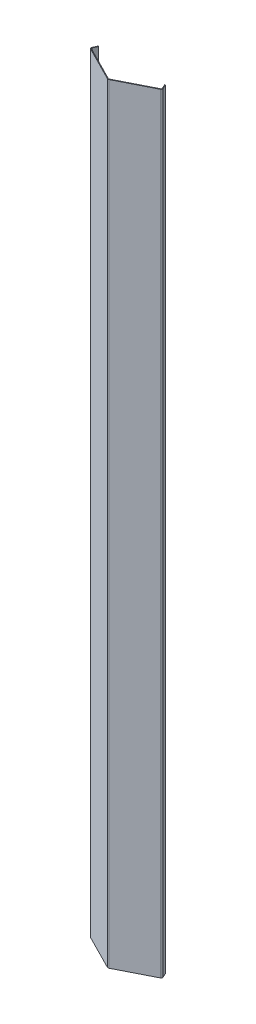
ISO-10303-21;
HEADER;
FILE_DESCRIPTION(('STEP AP214'),'2;1');
FILE_NAME('part.step','',(''),(''),'','','');
FILE_SCHEMA(('AUTOMOTIVE_DESIGN { 1 0 10303 214 1 1 1 1 }'));
ENDSEC;
DATA;
#1=APPLICATION_CONTEXT('core data for automotive mechanical design processes');
#2=APPLICATION_PROTOCOL_DEFINITION('international standard','automotive_design',2000,#1);
#3=PRODUCT_CONTEXT('',#1,'mechanical');
#4=PRODUCT('Part','Part','',(#3));
#5=PRODUCT_RELATED_PRODUCT_CATEGORY('part','',(#4));
#6=PRODUCT_DEFINITION_FORMATION('','',#4);
#7=PRODUCT_DEFINITION_CONTEXT('part definition',#1,'design');
#8=PRODUCT_DEFINITION('design','',#6,#7);
#9=PRODUCT_DEFINITION_SHAPE('','',#8);
#10=(LENGTH_UNIT() NAMED_UNIT(*) SI_UNIT(.MILLI.,.METRE.));
#11=(NAMED_UNIT(*) PLANE_ANGLE_UNIT() SI_UNIT($,.RADIAN.));
#12=(NAMED_UNIT(*) SI_UNIT($,.STERADIAN.) SOLID_ANGLE_UNIT());
#13=UNCERTAINTY_MEASURE_WITH_UNIT(LENGTH_MEASURE(1.E-05),#10,'distance_accuracy_value','');
#14=(GEOMETRIC_REPRESENTATION_CONTEXT(3) GLOBAL_UNCERTAINTY_ASSIGNED_CONTEXT((#13)) GLOBAL_UNIT_ASSIGNED_CONTEXT((#10,
#11,#12)) REPRESENTATION_CONTEXT('',''));
#15=CARTESIAN_POINT('',(0.,0.,0.));
#16=DIRECTION('',(0.,0.,1.));
#17=DIRECTION('',(1.,0.,0.));
#18=AXIS2_PLACEMENT_3D('',#15,#16,#17);
#19=CARTESIAN_POINT('',(-102.841397195583,4830.,-134.965277777778));
#20=DIRECTION('',(-0.409836101706064,0.,0.912159180043909));
#21=DIRECTION('',(0.912159180043909,0.,0.409836101706064));
#22=AXIS2_PLACEMENT_3D('',#19,#20,#21);
#23=PLANE('',#22);
#24=DIRECTION('',(-0.912159180043909,0.,-0.409836101706064));
#25=VECTOR('',#24,1.);
#26=CARTESIAN_POINT('',(-102.841397195583,0.,-134.965277777778));
#27=LINE('',#26,#25);
#28=CARTESIAN_POINT('',(-99.1927604754076,0.,-133.325933370954));
#29=VERTEX_POINT('',#28);
#30=CARTESIAN_POINT('',(-102.841397195583,0.,-134.965277777778));
#31=VERTEX_POINT('',#30);
#32=EDGE_CURVE('E177',#29,#31,#27,.T.);
#33=ORIENTED_EDGE('',*,*,#32,.T.);
#34=DIRECTION('',(0.,-1.,0.));
#35=VECTOR('',#34,1.);
#36=CARTESIAN_POINT('',(-102.841397195583,4830.,-134.965277777778));
#37=LINE('',#36,#35);
#38=CARTESIAN_POINT('',(-102.841397195583,4830.,-134.965277777778));
#39=VERTEX_POINT('',#38);
#40=EDGE_CURVE('E11',#39,#31,#37,.T.);
#41=ORIENTED_EDGE('',*,*,#40,.F.);
#42=DIRECTION('',(-0.912159180043909,0.,-0.409836101706064));
#43=VECTOR('',#42,1.);
#44=CARTESIAN_POINT('',(-102.841397195583,4830.,-134.965277777778));
#45=LINE('',#44,#43);
#46=CARTESIAN_POINT('',(-99.1927604754076,4830.,-133.325933370954));
#47=VERTEX_POINT('',#46);
#48=EDGE_CURVE('E207',#47,#39,#45,.T.);
#49=ORIENTED_EDGE('',*,*,#48,.F.);
#50=DIRECTION('',(0.,-1.,0.));
#51=VECTOR('',#50,1.);
#52=CARTESIAN_POINT('',(-99.1927604754076,4830.,-133.325933370954));
#53=LINE('',#52,#51);
#54=EDGE_CURVE('E173',#47,#29,#53,.T.);
#55=ORIENTED_EDGE('',*,*,#54,.T.);
#56=EDGE_LOOP('',(#33,#41,#49,#55));
#57=FACE_BOUND('',#56,.T.);
#58=ADVANCED_FACE('F33',(#57),#23,.F.);
#59=CARTESIAN_POINT('',(-102.841397195583,4830.,-134.965277777778));
#60=DIRECTION('',(0.91215918004391,0.,0.409836101706063));
#61=DIRECTION('',(0.409836101706063,0.,-0.91215918004391));
#62=AXIS2_PLACEMENT_3D('',#59,#60,#61);
#63=PLANE('',#62);
#64=DIRECTION('',(-0.409836101706063,0.,0.91215918004391));
#65=VECTOR('',#64,1.);
#66=CARTESIAN_POINT('',(-102.841397195583,0.,-134.965277777778));
#67=LINE('',#66,#65);
#68=CARTESIAN_POINT('',(-115.114033485366,0.,-107.65046141957));
#69=VERTEX_POINT('',#68);
#70=EDGE_CURVE('E180',#31,#69,#67,.T.);
#71=ORIENTED_EDGE('',*,*,#70,.T.);
#72=DIRECTION('',(0.,-1.,0.));
#73=VECTOR('',#72,1.);
#74=CARTESIAN_POINT('',(-115.114033485366,4830.,-107.65046141957));
#75=LINE('',#74,#73);
#76=CARTESIAN_POINT('',(-115.114033485366,4830.,-107.65046141957));
#77=VERTEX_POINT('',#76);
#78=EDGE_CURVE('E41',#77,#69,#75,.T.);
#79=ORIENTED_EDGE('',*,*,#78,.F.);
#80=DIRECTION('',(-0.409836101706063,0.,0.91215918004391));
#81=VECTOR('',#80,1.);
#82=CARTESIAN_POINT('',(-102.841397195583,4830.,-134.965277777778));
#83=LINE('',#82,#81);
#84=EDGE_CURVE('E116',#39,#77,#83,.T.);
#85=ORIENTED_EDGE('',*,*,#84,.F.);
#86=ORIENTED_EDGE('',*,*,#40,.T.);
#87=EDGE_LOOP('',(#71,#79,#85,#86));
#88=FACE_BOUND('',#87,.T.);
#89=ADVANCED_FACE('F305',(#88),#63,.F.);
#90=CARTESIAN_POINT('',(-105.992441684927,4830.,-103.552100402509));
#91=DIRECTION('',(0.,-1.,0.));
#92=DIRECTION('',(0.,0.,-1.));
#93=AXIS2_PLACEMENT_3D('',#90,#91,#92);
#94=CYLINDRICAL_SURFACE('',#93,10.);
#95=CARTESIAN_POINT('',(-105.992441684927,0.,-103.552100402509));
#96=DIRECTION('',(0.,1.,0.));
#97=DIRECTION('',(0.,0.,1.));
#98=AXIS2_PLACEMENT_3D('',#95,#96,#97);
#99=CIRCLE('',#98,10.);
#100=CARTESIAN_POINT('',(-110.511946464936,0.,-94.6316701133653));
#101=VERTEX_POINT('',#100);
#102=EDGE_CURVE('E182',#69,#101,#99,.T.);
#103=ORIENTED_EDGE('',*,*,#102,.T.);
#104=DIRECTION('',(0.,-1.,0.));
#105=VECTOR('',#104,1.);
#106=CARTESIAN_POINT('',(-110.511946464936,4830.,-94.6316701133653));
#107=LINE('',#106,#105);
#108=CARTESIAN_POINT('',(-110.511946464936,4830.,-94.6316701133653));
#109=VERTEX_POINT('',#108);
#110=EDGE_CURVE('E238',#109,#101,#107,.T.);
#111=ORIENTED_EDGE('',*,*,#110,.F.);
#112=CARTESIAN_POINT('',(-105.992441684927,4830.,-103.552100402509));
#113=DIRECTION('',(0.,1.,0.));
#114=DIRECTION('',(0.,0.,1.));
#115=AXIS2_PLACEMENT_3D('',#112,#113,#114);
#116=CIRCLE('',#115,10.);
#117=EDGE_CURVE('E246',#77,#109,#116,.T.);
#118=ORIENTED_EDGE('',*,*,#117,.F.);
#119=ORIENTED_EDGE('',*,*,#78,.T.);
#120=EDGE_LOOP('',(#103,#111,#118,#119));
#121=FACE_BOUND('',#120,.T.);
#122=ADVANCED_FACE('F244',(#121),#94,.T.);
#123=CARTESIAN_POINT('',(103.67090773331,4830.,13.8833232186408));
#124=DIRECTION('',(0.451950478000949,0.,-0.892043028914365));
#125=DIRECTION('',(-0.892043028914365,0.,-0.451950478000949));
#126=AXIS2_PLACEMENT_3D('',#123,#124,#125);
#127=PLANE('',#126);
#128=DIRECTION('',(0.892043028914365,0.,0.451950478000949));
#129=VECTOR('',#128,1.);
#130=CARTESIAN_POINT('',(103.67090773331,0.,13.8833232186408));
#131=LINE('',#130,#129);
#132=CARTESIAN_POINT('',(103.67090773331,0.,13.8833232186408));
#133=VERTEX_POINT('',#132);
#134=EDGE_CURVE('E184',#101,#133,#131,.T.);
#135=ORIENTED_EDGE('',*,*,#134,.T.);
#136=DIRECTION('',(0.,-1.,0.));
#137=VECTOR('',#136,1.);
#138=CARTESIAN_POINT('',(103.67090773331,4830.,13.8833232186408));
#139=LINE('',#138,#137);
#140=CARTESIAN_POINT('',(103.67090773331,4830.,13.8833232186408));
#141=VERTEX_POINT('',#140);
#142=EDGE_CURVE('E235',#141,#133,#139,.T.);
#143=ORIENTED_EDGE('',*,*,#142,.F.);
#144=DIRECTION('',(0.892043028914365,0.,0.451950478000949));
#145=VECTOR('',#144,1.);
#146=CARTESIAN_POINT('',(103.67090773331,4830.,13.8833232186408));
#147=LINE('',#146,#145);
#148=EDGE_CURVE('E264',#109,#141,#147,.T.);
#149=ORIENTED_EDGE('',*,*,#148,.F.);
#150=ORIENTED_EDGE('',*,*,#110,.T.);
#151=EDGE_LOOP('',(#135,#143,#149,#150));
#152=FACE_BOUND('',#151,.T.);
#153=ADVANCED_FACE('F255',(#152),#127,.F.);
#154=CARTESIAN_POINT('',(108.19041251332,4830.,4.96289292949717));
#155=DIRECTION('',(0.,-1.,0.));
#156=DIRECTION('',(0.,0.,-1.));
#157=AXIS2_PLACEMENT_3D('',#154,#155,#156);
#158=CYLINDRICAL_SURFACE('',#157,10.);
#159=CARTESIAN_POINT('',(108.19041251332,0.,4.96289292949717));
#160=DIRECTION('',(0.,1.,0.));
#161=DIRECTION('',(0.,0.,1.));
#162=AXIS2_PLACEMENT_3D('',#159,#160,#161);
#163=CIRCLE('',#162,10.);
#164=CARTESIAN_POINT('',(112.709917293329,0.,13.8833232186408));
#165=VERTEX_POINT('',#164);
#166=EDGE_CURVE('E186',#133,#165,#163,.T.);
#167=ORIENTED_EDGE('',*,*,#166,.T.);
#168=DIRECTION('',(0.,-1.,0.));
#169=VECTOR('',#168,1.);
#170=CARTESIAN_POINT('',(112.709917293329,4830.,13.8833232186408));
#171=LINE('',#170,#169);
#172=CARTESIAN_POINT('',(112.709917293329,4830.,13.8833232186408));
#173=VERTEX_POINT('',#172);
#174=EDGE_CURVE('E232',#173,#165,#171,.T.);
#175=ORIENTED_EDGE('',*,*,#174,.F.);
#176=CARTESIAN_POINT('',(108.19041251332,4830.,4.96289292949717));
#177=DIRECTION('',(0.,1.,0.));
#178=DIRECTION('',(0.,0.,1.));
#179=AXIS2_PLACEMENT_3D('',#176,#177,#178);
#180=CIRCLE('',#179,10.);
#181=EDGE_CURVE('E261',#141,#173,#180,.T.);
#182=ORIENTED_EDGE('',*,*,#181,.F.);
#183=ORIENTED_EDGE('',*,*,#142,.T.);
#184=EDGE_LOOP('',(#167,#175,#182,#183));
#185=FACE_BOUND('',#184,.T.);
#186=ADVANCED_FACE('F259',(#185),#158,.T.);
#187=CARTESIAN_POINT('',(112.709917293329,4830.,13.8833232186408));
#188=DIRECTION('',(-0.451950478000949,0.,-0.892043028914365));
#189=DIRECTION('',(-0.892043028914365,0.,0.451950478000949));
#190=AXIS2_PLACEMENT_3D('',#187,#188,#189);
#191=PLANE('',#190);
#192=DIRECTION('',(0.892043028914365,0.,-0.451950478000949));
#193=VECTOR('',#192,1.);
#194=CARTESIAN_POINT('',(112.709917293329,0.,13.8833232186408));
#195=LINE('',#194,#193);
#196=CARTESIAN_POINT('',(326.892771491575,0.,-94.6316701133653));
#197=VERTEX_POINT('',#196);
#198=EDGE_CURVE('E188',#165,#197,#195,.T.);
#199=ORIENTED_EDGE('',*,*,#198,.T.);
#200=DIRECTION('',(0.,-1.,0.));
#201=VECTOR('',#200,1.);
#202=CARTESIAN_POINT('',(326.892771491575,4830.,-94.6316701133653));
#203=LINE('',#202,#201);
#204=CARTESIAN_POINT('',(326.892771491575,4830.,-94.6316701133653));
#205=VERTEX_POINT('',#204);
#206=EDGE_CURVE('E229',#205,#197,#203,.T.);
#207=ORIENTED_EDGE('',*,*,#206,.F.);
#208=DIRECTION('',(0.892043028914365,0.,-0.451950478000949));
#209=VECTOR('',#208,1.);
#210=CARTESIAN_POINT('',(112.709917293329,4830.,13.8833232186408));
#211=LINE('',#210,#209);
#212=EDGE_CURVE('E263',#173,#205,#211,.T.);
#213=ORIENTED_EDGE('',*,*,#212,.F.);
#214=ORIENTED_EDGE('',*,*,#174,.T.);
#215=EDGE_LOOP('',(#199,#207,#213,#214));
#216=FACE_BOUND('',#215,.T.);
#217=ADVANCED_FACE('F318',(#216),#191,.F.);
#218=CARTESIAN_POINT('',(322.373266711566,4830.,-103.552100402509));
#219=DIRECTION('',(0.,-1.,0.));
#220=DIRECTION('',(0.,0.,-1.));
#221=AXIS2_PLACEMENT_3D('',#218,#219,#220);
#222=CYLINDRICAL_SURFACE('',#221,10.);
#223=CARTESIAN_POINT('',(322.373266711566,0.,-103.552100402509));
#224=DIRECTION('',(0.,1.,0.));
#225=DIRECTION('',(0.,0.,-1.));
#226=AXIS2_PLACEMENT_3D('',#223,#224,#225);
#227=CIRCLE('',#226,10.);
#228=CARTESIAN_POINT('',(331.494858512005,0.,-107.65046141957));
#229=VERTEX_POINT('',#228);
#230=EDGE_CURVE('E190',#197,#229,#227,.T.);
#231=ORIENTED_EDGE('',*,*,#230,.T.);
#232=DIRECTION('',(0.,-1.,0.));
#233=VECTOR('',#232,1.);
#234=CARTESIAN_POINT('',(331.494858512005,4830.,-107.65046141957));
#235=LINE('',#234,#233);
#236=CARTESIAN_POINT('',(331.494858512005,4830.,-107.65046141957));
#237=VERTEX_POINT('',#236);
#238=EDGE_CURVE('E226',#237,#229,#235,.T.);
#239=ORIENTED_EDGE('',*,*,#238,.F.);
#240=CARTESIAN_POINT('',(322.373266711566,4830.,-103.552100402509));
#241=DIRECTION('',(0.,1.,0.));
#242=DIRECTION('',(0.,0.,-1.));
#243=AXIS2_PLACEMENT_3D('',#240,#241,#242);
#244=CIRCLE('',#243,10.);
#245=EDGE_CURVE('E266',#205,#237,#244,.T.);
#246=ORIENTED_EDGE('',*,*,#245,.F.);
#247=ORIENTED_EDGE('',*,*,#206,.T.);
#248=EDGE_LOOP('',(#231,#239,#246,#247));
#249=FACE_BOUND('',#248,.T.);
#250=ADVANCED_FACE('F321',(#249),#222,.T.);
#251=CARTESIAN_POINT('',(319.222222222222,4830.,-134.965277777778));
#252=DIRECTION('',(-0.91215918004391,0.,0.409836101706063));
#253=DIRECTION('',(0.409836101706063,0.,0.91215918004391));
#254=AXIS2_PLACEMENT_3D('',#251,#252,#253);
#255=PLANE('',#254);
#256=DIRECTION('',(-0.409836101706063,0.,-0.91215918004391));
#257=VECTOR('',#256,1.);
#258=CARTESIAN_POINT('',(319.222222222222,0.,-134.965277777778));
#259=LINE('',#258,#257);
#260=CARTESIAN_POINT('',(319.222222222222,0.,-134.965277777778));
#261=VERTEX_POINT('',#260);
#262=EDGE_CURVE('E192',#229,#261,#259,.T.);
#263=ORIENTED_EDGE('',*,*,#262,.T.);
#264=DIRECTION('',(0.,-1.,0.));
#265=VECTOR('',#264,1.);
#266=CARTESIAN_POINT('',(319.222222222222,4830.,-134.965277777778));
#267=LINE('',#266,#265);
#268=CARTESIAN_POINT('',(319.222222222222,4830.,-134.965277777778));
#269=VERTEX_POINT('',#268);
#270=EDGE_CURVE('E223',#269,#261,#267,.T.);
#271=ORIENTED_EDGE('',*,*,#270,.F.);
#272=DIRECTION('',(-0.409836101706063,0.,-0.91215918004391));
#273=VECTOR('',#272,1.);
#274=CARTESIAN_POINT('',(319.222222222222,4830.,-134.965277777778));
#275=LINE('',#274,#273);
#276=EDGE_CURVE('E272',#237,#269,#275,.T.);
#277=ORIENTED_EDGE('',*,*,#276,.F.);
#278=ORIENTED_EDGE('',*,*,#238,.T.);
#279=EDGE_LOOP('',(#263,#271,#277,#278));
#280=FACE_BOUND('',#279,.T.);
#281=ADVANCED_FACE('F325',(#280),#255,.F.);
#282=CARTESIAN_POINT('',(319.222222222222,4830.,-134.965277777778));
#283=DIRECTION('',(0.409836101706065,0.,0.912159180043909));
#284=DIRECTION('',(0.912159180043909,0.,-0.409836101706065));
#285=AXIS2_PLACEMENT_3D('',#282,#283,#284);
#286=PLANE('',#285);
#287=DIRECTION('',(-0.912159180043909,0.,0.409836101706065));
#288=VECTOR('',#287,1.);
#289=CARTESIAN_POINT('',(319.222222222222,0.,-134.965277777778));
#290=LINE('',#289,#288);
#291=CARTESIAN_POINT('',(315.573585502047,0.,-133.325933370954));
#292=VERTEX_POINT('',#291);
#293=EDGE_CURVE('E194',#261,#292,#290,.T.);
#294=ORIENTED_EDGE('',*,*,#293,.T.);
#295=DIRECTION('',(0.,-1.,0.));
#296=VECTOR('',#295,1.);
#297=CARTESIAN_POINT('',(315.573585502047,4830.,-133.325933370954));
#298=LINE('',#297,#296);
#299=CARTESIAN_POINT('',(315.573585502047,4830.,-133.325933370954));
#300=VERTEX_POINT('',#299);
#301=EDGE_CURVE('E220',#300,#292,#298,.T.);
#302=ORIENTED_EDGE('',*,*,#301,.F.);
#303=DIRECTION('',(-0.912159180043909,0.,0.409836101706065));
#304=VECTOR('',#303,1.);
#305=CARTESIAN_POINT('',(319.222222222222,4830.,-134.965277777778));
#306=LINE('',#305,#304);
#307=EDGE_CURVE('E274',#269,#300,#306,.T.);
#308=ORIENTED_EDGE('',*,*,#307,.F.);
#309=ORIENTED_EDGE('',*,*,#270,.T.);
#310=EDGE_LOOP('',(#294,#302,#308,#309));
#311=FACE_BOUND('',#310,.T.);
#312=ADVANCED_FACE('F329',(#311),#286,.F.);
#313=CARTESIAN_POINT('',(315.573585502047,4830.,-133.325933370954));
#314=DIRECTION('',(0.912159180043909,0.,-0.409836101706063));
#315=DIRECTION('',(-0.409836101706063,0.,-0.91215918004391));
#316=AXIS2_PLACEMENT_3D('',#313,#314,#315);
#317=PLANE('',#316);
#318=DIRECTION('',(0.409836101706063,0.,0.91215918004391));
#319=VECTOR('',#318,1.);
#320=CARTESIAN_POINT('',(315.573585502047,0.,-133.325933370954));
#321=LINE('',#320,#319);
#322=CARTESIAN_POINT('',(327.846221791829,0.,-106.011117012745));
#323=VERTEX_POINT('',#322);
#324=EDGE_CURVE('E196',#292,#323,#321,.T.);
#325=ORIENTED_EDGE('',*,*,#324,.T.);
#326=DIRECTION('',(0.,-1.,0.));
#327=VECTOR('',#326,1.);
#328=CARTESIAN_POINT('',(327.846221791829,4830.,-106.011117012745));
#329=LINE('',#328,#327);
#330=CARTESIAN_POINT('',(327.846221791829,4830.,-106.011117012745));
#331=VERTEX_POINT('',#330);
#332=EDGE_CURVE('E217',#331,#323,#329,.T.);
#333=ORIENTED_EDGE('',*,*,#332,.F.);
#334=DIRECTION('',(0.409836101706063,0.,0.91215918004391));
#335=VECTOR('',#334,1.);
#336=CARTESIAN_POINT('',(315.573585502047,4830.,-133.325933370954));
#337=LINE('',#336,#335);
#338=EDGE_CURVE('E276',#300,#331,#337,.T.);
#339=ORIENTED_EDGE('',*,*,#338,.F.);
#340=ORIENTED_EDGE('',*,*,#301,.T.);
#341=EDGE_LOOP('',(#325,#333,#339,#340));
#342=FACE_BOUND('',#341,.T.);
#343=ADVANCED_FACE('F333',(#342),#317,.F.);
#344=CARTESIAN_POINT('',(322.373266711566,4830.,-103.552100402509));
#345=DIRECTION('',(0.,-1.,0.));
#346=DIRECTION('',(0.,0.,-1.));
#347=AXIS2_PLACEMENT_3D('',#344,#345,#346);
#348=CYLINDRICAL_SURFACE('',#347,6.);
#349=CARTESIAN_POINT('',(322.373266711566,0.,-103.552100402509));
#350=DIRECTION('',(0.,-1.,0.));
#351=DIRECTION('',(0.,0.,-1.));
#352=AXIS2_PLACEMENT_3D('',#349,#350,#351);
#353=CIRCLE('',#352,6.);
#354=CARTESIAN_POINT('',(325.084969579571,0.,-98.1998422290227));
#355=VERTEX_POINT('',#354);
#356=EDGE_CURVE('E198',#323,#355,#353,.T.);
#357=ORIENTED_EDGE('',*,*,#356,.T.);
#358=DIRECTION('',(0.,-1.,0.));
#359=VECTOR('',#358,1.);
#360=CARTESIAN_POINT('',(325.084969579571,4830.,-98.1998422290227));
#361=LINE('',#360,#359);
#362=CARTESIAN_POINT('',(325.084969579571,4830.,-98.1998422290227));
#363=VERTEX_POINT('',#362);
#364=EDGE_CURVE('E214',#363,#355,#361,.T.);
#365=ORIENTED_EDGE('',*,*,#364,.F.);
#366=CARTESIAN_POINT('',(322.373266711566,4830.,-103.552100402509));
#367=DIRECTION('',(0.,-1.,0.));
#368=DIRECTION('',(0.,0.,-1.));
#369=AXIS2_PLACEMENT_3D('',#366,#367,#368);
#370=CIRCLE('',#369,6.);
#371=EDGE_CURVE('E278',#331,#363,#370,.T.);
#372=ORIENTED_EDGE('',*,*,#371,.F.);
#373=ORIENTED_EDGE('',*,*,#332,.T.);
#374=EDGE_LOOP('',(#357,#365,#372,#373));
#375=FACE_BOUND('',#374,.T.);
#376=ADVANCED_FACE('F337',(#375),#348,.F.);
#377=CARTESIAN_POINT('',(110.902115381325,4830.,10.3151511029834));
#378=DIRECTION('',(0.451950478000949,0.,0.892043028914364));
#379=DIRECTION('',(0.892043028914365,0.,-0.451950478000949));
#380=AXIS2_PLACEMENT_3D('',#377,#378,#379);
#381=PLANE('',#380);
#382=DIRECTION('',(-0.892043028914365,0.,0.451950478000949));
#383=VECTOR('',#382,1.);
#384=CARTESIAN_POINT('',(110.902115381325,0.,10.3151511029834));
#385=LINE('',#384,#383);
#386=CARTESIAN_POINT('',(110.902115381325,0.,10.3151511029834));
#387=VERTEX_POINT('',#386);
#388=EDGE_CURVE('E200',#355,#387,#385,.T.);
#389=ORIENTED_EDGE('',*,*,#388,.T.);
#390=DIRECTION('',(0.,-1.,0.));
#391=VECTOR('',#390,1.);
#392=CARTESIAN_POINT('',(110.902115381325,4830.,10.3151511029834));
#393=LINE('',#392,#391);
#394=CARTESIAN_POINT('',(110.902115381325,4830.,10.3151511029834));
#395=VERTEX_POINT('',#394);
#396=EDGE_CURVE('E211',#395,#387,#393,.T.);
#397=ORIENTED_EDGE('',*,*,#396,.F.);
#398=DIRECTION('',(-0.892043028914365,0.,0.451950478000949));
#399=VECTOR('',#398,1.);
#400=CARTESIAN_POINT('',(110.902115381325,4830.,10.3151511029834));
#401=LINE('',#400,#399);
#402=EDGE_CURVE('E280',#363,#395,#401,.T.);
#403=ORIENTED_EDGE('',*,*,#402,.F.);
#404=ORIENTED_EDGE('',*,*,#364,.T.);
#405=EDGE_LOOP('',(#389,#397,#403,#404));
#406=FACE_BOUND('',#405,.T.);
#407=ADVANCED_FACE('F286',(#406),#381,.F.);
#408=CARTESIAN_POINT('',(108.19041251332,4830.,4.96289292949717));
#409=DIRECTION('',(0.,-1.,0.));
#410=DIRECTION('',(0.,0.,-1.));
#411=AXIS2_PLACEMENT_3D('',#408,#409,#410);
#412=CYLINDRICAL_SURFACE('',#411,6.00000000000002);
#413=CARTESIAN_POINT('',(108.19041251332,0.,4.96289292949717));
#414=DIRECTION('',(0.,-1.,0.));
#415=DIRECTION('',(0.,0.,1.));
#416=AXIS2_PLACEMENT_3D('',#413,#414,#415);
#417=CIRCLE('',#416,6.00000000000002);
#418=CARTESIAN_POINT('',(105.478709645314,0.,10.3151511029834));
#419=VERTEX_POINT('',#418);
#420=EDGE_CURVE('E202',#387,#419,#417,.T.);
#421=ORIENTED_EDGE('',*,*,#420,.T.);
#422=DIRECTION('',(0.,-1.,0.));
#423=VECTOR('',#422,1.);
#424=CARTESIAN_POINT('',(105.478709645314,4830.,10.3151511029834));
#425=LINE('',#424,#423);
#426=CARTESIAN_POINT('',(105.478709645314,4830.,10.3151511029834));
#427=VERTEX_POINT('',#426);
#428=EDGE_CURVE('E168',#427,#419,#425,.T.);
#429=ORIENTED_EDGE('',*,*,#428,.F.);
#430=CARTESIAN_POINT('',(108.19041251332,4830.,4.96289292949717));
#431=DIRECTION('',(0.,-1.,0.));
#432=DIRECTION('',(0.,0.,1.));
#433=AXIS2_PLACEMENT_3D('',#430,#431,#432);
#434=CIRCLE('',#433,6.00000000000002);
#435=EDGE_CURVE('E159',#395,#427,#434,.T.);
#436=ORIENTED_EDGE('',*,*,#435,.F.);
#437=ORIENTED_EDGE('',*,*,#396,.T.);
#438=EDGE_LOOP('',(#421,#429,#436,#437));
#439=FACE_BOUND('',#438,.T.);
#440=ADVANCED_FACE('F290',(#439),#412,.F.);
#441=CARTESIAN_POINT('',(105.478709645314,4830.,10.3151511029834));
#442=DIRECTION('',(-0.451950478000949,0.,0.892043028914364));
#443=DIRECTION('',(0.892043028914365,0.,0.451950478000949));
#444=AXIS2_PLACEMENT_3D('',#441,#442,#443);
#445=PLANE('',#444);
#446=DIRECTION('',(-0.892043028914365,0.,-0.451950478000949));
#447=VECTOR('',#446,1.);
#448=CARTESIAN_POINT('',(105.478709645314,0.,10.3151511029834));
#449=LINE('',#448,#447);
#450=CARTESIAN_POINT('',(-108.704144552932,0.,-98.1998422290227));
#451=VERTEX_POINT('',#450);
#452=EDGE_CURVE('E167',#419,#451,#449,.T.);
#453=ORIENTED_EDGE('',*,*,#452,.T.);
#454=DIRECTION('',(0.,-1.,0.));
#455=VECTOR('',#454,1.);
#456=CARTESIAN_POINT('',(-108.704144552932,4830.,-98.1998422290227));
#457=LINE('',#456,#455);
#458=CARTESIAN_POINT('',(-108.704144552932,4830.,-98.1998422290227));
#459=VERTEX_POINT('',#458);
#460=EDGE_CURVE('E164',#459,#451,#457,.T.);
#461=ORIENTED_EDGE('',*,*,#460,.F.);
#462=DIRECTION('',(-0.892043028914365,0.,-0.451950478000949));
#463=VECTOR('',#462,1.);
#464=CARTESIAN_POINT('',(105.478709645314,4830.,10.3151511029834));
#465=LINE('',#464,#463);
#466=EDGE_CURVE('E153',#427,#459,#465,.T.);
#467=ORIENTED_EDGE('',*,*,#466,.F.);
#468=ORIENTED_EDGE('',*,*,#428,.T.);
#469=EDGE_LOOP('',(#453,#461,#467,#468));
#470=FACE_BOUND('',#469,.T.);
#471=ADVANCED_FACE('F165',(#470),#445,.F.);
#472=CARTESIAN_POINT('',(-105.992441684927,4830.,-103.552100402509));
#473=DIRECTION('',(0.,-1.,0.));
#474=DIRECTION('',(0.,0.,-1.));
#475=AXIS2_PLACEMENT_3D('',#472,#473,#474);
#476=CYLINDRICAL_SURFACE('',#475,5.99999999999999);
#477=CARTESIAN_POINT('',(-105.992441684927,0.,-103.552100402509));
#478=DIRECTION('',(0.,-1.,0.));
#479=DIRECTION('',(0.,0.,1.));
#480=AXIS2_PLACEMENT_3D('',#477,#478,#479);
#481=CIRCLE('',#480,5.99999999999999);
#482=CARTESIAN_POINT('',(-111.46539676519,0.,-106.011117012745));
#483=VERTEX_POINT('',#482);
#484=EDGE_CURVE('E102',#451,#483,#481,.T.);
#485=ORIENTED_EDGE('',*,*,#484,.T.);
#486=DIRECTION('',(0.,-1.,0.));
#487=VECTOR('',#486,1.);
#488=CARTESIAN_POINT('',(-111.46539676519,4830.,-106.011117012745));
#489=LINE('',#488,#487);
#490=CARTESIAN_POINT('',(-111.46539676519,4830.,-106.011117012745));
#491=VERTEX_POINT('',#490);
#492=EDGE_CURVE('E169',#491,#483,#489,.T.);
#493=ORIENTED_EDGE('',*,*,#492,.F.);
#494=CARTESIAN_POINT('',(-105.992441684927,4830.,-103.552100402509));
#495=DIRECTION('',(0.,-1.,0.));
#496=DIRECTION('',(0.,0.,1.));
#497=AXIS2_PLACEMENT_3D('',#494,#495,#496);
#498=CIRCLE('',#497,5.99999999999999);
#499=EDGE_CURVE('E157',#459,#491,#498,.T.);
#500=ORIENTED_EDGE('',*,*,#499,.F.);
#501=ORIENTED_EDGE('',*,*,#460,.T.);
#502=EDGE_LOOP('',(#485,#493,#500,#501));
#503=FACE_BOUND('',#502,.T.);
#504=ADVANCED_FACE('F171',(#503),#476,.F.);
#505=CARTESIAN_POINT('',(-99.1927604754076,4830.,-133.325933370954));
#506=DIRECTION('',(-0.91215918004391,0.,-0.409836101706063));
#507=DIRECTION('',(-0.409836101706063,0.,0.91215918004391));
#508=AXIS2_PLACEMENT_3D('',#505,#506,#507);
#509=PLANE('',#508);
#510=DIRECTION('',(0.409836101706063,0.,-0.91215918004391));
#511=VECTOR('',#510,1.);
#512=CARTESIAN_POINT('',(-99.1927604754076,0.,-133.325933370954));
#513=LINE('',#512,#511);
#514=EDGE_CURVE('E108',#483,#29,#513,.T.);
#515=ORIENTED_EDGE('',*,*,#514,.T.);
#516=ORIENTED_EDGE('',*,*,#54,.F.);
#517=DIRECTION('',(0.409836101706063,0.,-0.91215918004391));
#518=VECTOR('',#517,1.);
#519=CARTESIAN_POINT('',(-99.1927604754076,4830.,-133.325933370954));
#520=LINE('',#519,#518);
#521=EDGE_CURVE('E49',#491,#47,#520,.T.);
#522=ORIENTED_EDGE('',*,*,#521,.F.);
#523=ORIENTED_EDGE('',*,*,#492,.T.);
#524=EDGE_LOOP('',(#515,#516,#522,#523));
#525=FACE_BOUND('',#524,.T.);
#526=ADVANCED_FACE('F294',(#525),#509,.F.);
#527=CARTESIAN_POINT('',(-105.992441684927,4830.,-103.552100402509));
#528=DIRECTION('',(0.,1.,0.));
#529=DIRECTION('',(0.,0.,1.));
#530=AXIS2_PLACEMENT_3D('',#527,#528,#529);
#531=PLANE('',#530);
#532=ORIENTED_EDGE('',*,*,#48,.T.);
#533=ORIENTED_EDGE('',*,*,#84,.T.);
#534=ORIENTED_EDGE('',*,*,#117,.T.);
#535=ORIENTED_EDGE('',*,*,#148,.T.);
#536=ORIENTED_EDGE('',*,*,#181,.T.);
#537=ORIENTED_EDGE('',*,*,#212,.T.);
#538=ORIENTED_EDGE('',*,*,#245,.T.);
#539=ORIENTED_EDGE('',*,*,#276,.T.);
#540=ORIENTED_EDGE('',*,*,#307,.T.);
#541=ORIENTED_EDGE('',*,*,#338,.T.);
#542=ORIENTED_EDGE('',*,*,#371,.T.);
#543=ORIENTED_EDGE('',*,*,#402,.T.);
#544=ORIENTED_EDGE('',*,*,#435,.T.);
#545=ORIENTED_EDGE('',*,*,#466,.T.);
#546=ORIENTED_EDGE('',*,*,#499,.T.);
#547=ORIENTED_EDGE('',*,*,#521,.T.);
#548=EDGE_LOOP('',(#532,#533,#534,#535,#536,#537,#538,#539,#540,#541,#542,#543,#544,#545,#546,#547));
#549=FACE_BOUND('',#548,.T.);
#550=ADVANCED_FACE('F155',(#549),#531,.T.);
#551=CARTESIAN_POINT('',(-105.992441684927,0.,-103.552100402509));
#552=DIRECTION('',(0.,1.,0.));
#553=DIRECTION('',(0.,0.,1.));
#554=AXIS2_PLACEMENT_3D('',#551,#552,#553);
#555=PLANE('',#554);
#556=ORIENTED_EDGE('',*,*,#32,.F.);
#557=ORIENTED_EDGE('',*,*,#514,.F.);
#558=ORIENTED_EDGE('',*,*,#484,.F.);
#559=ORIENTED_EDGE('',*,*,#452,.F.);
#560=ORIENTED_EDGE('',*,*,#420,.F.);
#561=ORIENTED_EDGE('',*,*,#388,.F.);
#562=ORIENTED_EDGE('',*,*,#356,.F.);
#563=ORIENTED_EDGE('',*,*,#324,.F.);
#564=ORIENTED_EDGE('',*,*,#293,.F.);
#565=ORIENTED_EDGE('',*,*,#262,.F.);
#566=ORIENTED_EDGE('',*,*,#230,.F.);
#567=ORIENTED_EDGE('',*,*,#198,.F.);
#568=ORIENTED_EDGE('',*,*,#166,.F.);
#569=ORIENTED_EDGE('',*,*,#134,.F.);
#570=ORIENTED_EDGE('',*,*,#102,.F.);
#571=ORIENTED_EDGE('',*,*,#70,.F.);
#572=EDGE_LOOP('',(#556,#557,#558,#559,#560,#561,#562,#563,#564,#565,#566,#567,#568,#569,#570,#571));
#573=FACE_BOUND('',#572,.T.);
#574=ADVANCED_FACE('F250',(#573),#555,.F.);
#575=CLOSED_SHELL('',(#58,#89,#122,#153,#186,#217,#250,#281,#312,#343,#376,#407,#440,#471,#504,
#526,#550,#574));
#576=MANIFOLD_SOLID_BREP('B2',#575);
#577=ADVANCED_BREP_SHAPE_REPRESENTATION('',(#18,#576),#14);
#578=SHAPE_DEFINITION_REPRESENTATION(#9,#577);
ENDSEC;
END-ISO-10303-21;
